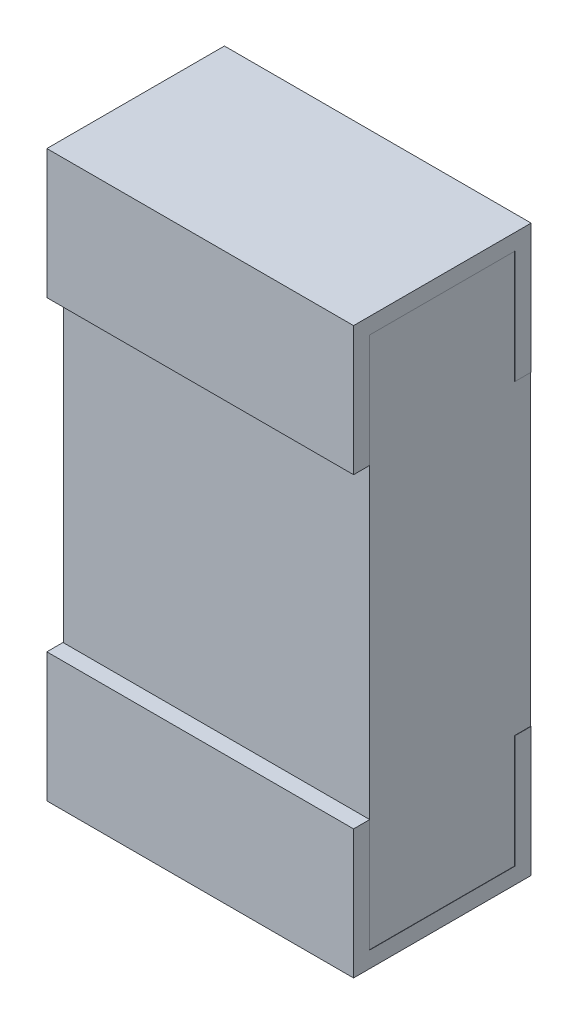
ISO-10303-21;
HEADER;
FILE_DESCRIPTION(('STEP AP214'),'2;1');
FILE_NAME('part.step','',(''),(''),'','','');
FILE_SCHEMA(('AUTOMOTIVE_DESIGN { 1 0 10303 214 1 1 1 1 }'));
ENDSEC;
DATA;
#1=APPLICATION_CONTEXT('core data for automotive mechanical design processes');
#2=APPLICATION_PROTOCOL_DEFINITION('international standard','automotive_design',2000,#1);
#3=PRODUCT_CONTEXT('',#1,'mechanical');
#4=PRODUCT('Part','Part','',(#3));
#5=PRODUCT_RELATED_PRODUCT_CATEGORY('part','',(#4));
#6=PRODUCT_DEFINITION_FORMATION('','',#4);
#7=PRODUCT_DEFINITION_CONTEXT('part definition',#1,'design');
#8=PRODUCT_DEFINITION('design','',#6,#7);
#9=PRODUCT_DEFINITION_SHAPE('','',#8);
#10=(LENGTH_UNIT() NAMED_UNIT(*) SI_UNIT(.MILLI.,.METRE.));
#11=(NAMED_UNIT(*) PLANE_ANGLE_UNIT() SI_UNIT($,.RADIAN.));
#12=(NAMED_UNIT(*) SI_UNIT($,.STERADIAN.) SOLID_ANGLE_UNIT());
#13=UNCERTAINTY_MEASURE_WITH_UNIT(LENGTH_MEASURE(1.E-05),#10,'distance_accuracy_value','');
#14=(GEOMETRIC_REPRESENTATION_CONTEXT(3) GLOBAL_UNCERTAINTY_ASSIGNED_CONTEXT((#13)) GLOBAL_UNIT_ASSIGNED_CONTEXT((#10,
#11,#12)) REPRESENTATION_CONTEXT('',''));
#15=CARTESIAN_POINT('',(0.,0.,0.));
#16=DIRECTION('',(0.,0.,1.));
#17=DIRECTION('',(1.,0.,0.));
#18=AXIS2_PLACEMENT_3D('',#15,#16,#17);
#19=CARTESIAN_POINT('',(-8.60769899649028,16.9660232839229,-0.486994255555745));
#20=DIRECTION('',(-1.,1.19248806384999E-08,0.));
#21=DIRECTION('',(0.,-8.74227339409095E-08,1.));
#22=AXIS2_PLACEMENT_3D('',#19,#20,#21);
#23=PLANE('',#22);
#24=DIRECTION('',(-1.19248806384999E-08,-1.,-8.74227339409095E-08));
#25=VECTOR('',#24,1.);
#26=CARTESIAN_POINT('',(-8.61246893890766,-399982.208976715,-0.521963277008353));
#27=LINE('',#26,#25);
#28=CARTESIAN_POINT('',(-8.60769899231657,17.3160232839487,-0.486994224957847));
#29=VERTEX_POINT('',#28);
#30=CARTESIAN_POINT('',(-8.60769899649028,16.9660232839228,-0.486994255555804));
#31=VERTEX_POINT('',#30);
#32=EDGE_CURVE('E276',#29,#31,#27,.T.);
#33=ORIENTED_EDGE('',*,*,#32,.F.);
#34=DIRECTION('',(0.,-8.74227339409095E-08,1.));
#35=VECTOR('',#34,1.);
#36=CARTESIAN_POINT('',(-8.60769899231657,17.3415156849243,-291599.706400024));
#37=LINE('',#36,#35);
#38=CARTESIAN_POINT('',(-8.60769899231657,17.3160232883198,-0.536994224945663));
#39=VERTEX_POINT('',#38);
#40=EDGE_CURVE('E28',#39,#29,#37,.T.);
#41=ORIENTED_EDGE('',*,*,#40,.F.);
#42=DIRECTION('',(1.19248806384999E-08,1.,8.74227339409095E-08));
#43=VECTOR('',#42,1.);
#44=CARTESIAN_POINT('',(-8.61246893890766,-399982.208976711,-0.571963276996353));
#45=LINE('',#44,#43);
#46=CARTESIAN_POINT('',(-8.60769899708652,16.9160232883061,-0.536994259914756));
#47=VERTEX_POINT('',#46);
#48=EDGE_CURVE('E335',#47,#39,#45,.T.);
#49=ORIENTED_EDGE('',*,*,#48,.F.);
#50=DIRECTION('',(0.,8.74227339409095E-08,-1.));
#51=VECTOR('',#50,1.);
#52=CARTESIAN_POINT('',(-8.60769899708652,16.9415156849103,-291599.706400059));
#53=LINE('',#52,#51);
#54=CARTESIAN_POINT('',(-8.60769899708652,16.9160232402236,0.0130057400611174));
#55=VERTEX_POINT('',#54);
#56=EDGE_CURVE('E1057',#55,#47,#53,.T.);
#57=ORIENTED_EDGE('',*,*,#56,.F.);
#58=DIRECTION('',(-1.19248806384999E-08,-1.,-8.74227339409095E-08));
#59=VECTOR('',#58,1.);
#60=CARTESIAN_POINT('',(-8.61246893890766,-399982.208976759,-0.0219632770203544));
#61=LINE('',#60,#59);
#62=CARTESIAN_POINT('',(-8.60769899231657,17.3160232402373,0.013005775030211));
#63=VERTEX_POINT('',#62);
#64=EDGE_CURVE('E1075',#63,#55,#61,.T.);
#65=ORIENTED_EDGE('',*,*,#64,.F.);
#66=CARTESIAN_POINT('',(-8.60769899231657,17.3160232446085,-0.036994224956362));
#67=VERTEX_POINT('',#66);
#68=EDGE_CURVE('E340',#67,#63,#37,.T.);
#69=ORIENTED_EDGE('',*,*,#68,.F.);
#70=DIRECTION('',(1.19248806384999E-08,1.,8.74227339409095E-08));
#71=VECTOR('',#70,1.);
#72=CARTESIAN_POINT('',(-8.61246893890766,-399982.208976755,-0.0719632770078043));
#73=LINE('',#72,#71);
#74=CARTESIAN_POINT('',(-8.60769899649028,16.9660232445825,-0.0369942555534424));
#75=VERTEX_POINT('',#74);
#76=EDGE_CURVE('E397',#75,#67,#73,.T.);
#77=ORIENTED_EDGE('',*,*,#76,.F.);
#78=DIRECTION('',(0.,-8.74227339409095E-08,1.));
#79=VECTOR('',#78,1.);
#80=CARTESIAN_POINT('',(-8.60769899649028,16.9915156848983,-291599.706400055));
#81=LINE('',#80,#79);
#82=EDGE_CURVE('E342',#31,#75,#81,.T.);
#83=ORIENTED_EDGE('',*,*,#82,.F.);
#84=EDGE_LOOP('',(#33,#41,#49,#57,#65,#69,#77,#83));
#85=FACE_BOUND('',#84,.T.);
#86=ADVANCED_FACE('F17',(#85),#23,.T.);
#87=CARTESIAN_POINT('',(-7.65769899649027,16.9660232725942,-0.486994255555746));
#88=DIRECTION('',(-1.,1.19248806384999E-08,0.));
#89=DIRECTION('',(0.,-8.74227339409095E-08,1.));
#90=AXIS2_PLACEMENT_3D('',#87,#88,#89);
#91=PLANE('',#90);
#92=DIRECTION('',(-1.19248806384999E-08,-1.,-8.74227339409095E-08));
#93=VECTOR('',#92,1.);
#94=CARTESIAN_POINT('',(-7.66246893890765,-399982.208976727,-0.521963277008354));
#95=LINE('',#94,#93);
#96=CARTESIAN_POINT('',(-7.65769899231658,17.3160232726201,-0.486994224957848));
#97=VERTEX_POINT('',#96);
#98=CARTESIAN_POINT('',(-7.65769899649027,16.9660232725941,-0.486994255555805));
#99=VERTEX_POINT('',#98);
#100=EDGE_CURVE('E252',#97,#99,#95,.T.);
#101=ORIENTED_EDGE('',*,*,#100,.T.);
#102=DIRECTION('',(0.,-8.74227339409095E-08,1.));
#103=VECTOR('',#102,1.);
#104=CARTESIAN_POINT('',(-7.65769899649027,16.9915156735697,-291599.706400055));
#105=LINE('',#104,#103);
#106=CARTESIAN_POINT('',(-7.65769899649027,16.9660232332539,-0.0369942555534433));
#107=VERTEX_POINT('',#106);
#108=EDGE_CURVE('E283',#99,#107,#105,.T.);
#109=ORIENTED_EDGE('',*,*,#108,.T.);
#110=DIRECTION('',(1.19248806384999E-08,1.,8.74227339409095E-08));
#111=VECTOR('',#110,1.);
#112=CARTESIAN_POINT('',(-7.65769899649027,16.966023233254,-0.0369942555551971));
#113=LINE('',#112,#111);
#114=CARTESIAN_POINT('',(-7.65769899231658,17.3160232332799,-0.0369942249563629));
#115=VERTEX_POINT('',#114);
#116=EDGE_CURVE('E369',#107,#115,#113,.T.);
#117=ORIENTED_EDGE('',*,*,#116,.T.);
#118=DIRECTION('',(0.,-8.74227339409095E-08,1.));
#119=VECTOR('',#118,1.);
#120=CARTESIAN_POINT('',(-7.65769899231658,17.3415156735958,-291599.706400024));
#121=LINE('',#120,#119);
#122=CARTESIAN_POINT('',(-7.65769899231658,17.3160232289087,0.0130057750302097));
#123=VERTEX_POINT('',#122);
#124=EDGE_CURVE('E436',#115,#123,#121,.T.);
#125=ORIENTED_EDGE('',*,*,#124,.T.);
#126=DIRECTION('',(-1.19248806384999E-08,-1.,-8.74227339409095E-08));
#127=VECTOR('',#126,1.);
#128=CARTESIAN_POINT('',(-7.66246893890765,-399982.20897677,-0.0219632770203553));
#129=LINE('',#128,#127);
#130=CARTESIAN_POINT('',(-7.65769899708652,16.916023228895,0.0130057400611161));
#131=VERTEX_POINT('',#130);
#132=EDGE_CURVE('E1060',#123,#131,#129,.T.);
#133=ORIENTED_EDGE('',*,*,#132,.T.);
#134=DIRECTION('',(0.,8.74227339409095E-08,-1.));
#135=VECTOR('',#134,1.);
#136=CARTESIAN_POINT('',(-7.65769899708652,16.9415156735818,-291599.706400059));
#137=LINE('',#136,#135);
#138=CARTESIAN_POINT('',(-7.65769899708652,16.9160232769775,-0.536994259914757));
#139=VERTEX_POINT('',#138);
#140=EDGE_CURVE('E1050',#131,#139,#137,.T.);
#141=ORIENTED_EDGE('',*,*,#140,.T.);
#142=DIRECTION('',(1.19248806384999E-08,1.,8.74227339409095E-08));
#143=VECTOR('',#142,1.);
#144=CARTESIAN_POINT('',(-7.66246893890765,-399982.208976722,-0.571963276996354));
#145=LINE('',#144,#143);
#146=CARTESIAN_POINT('',(-7.65769899231658,17.3160232769912,-0.536994224945664));
#147=VERTEX_POINT('',#146);
#148=EDGE_CURVE('E255',#139,#147,#145,.T.);
#149=ORIENTED_EDGE('',*,*,#148,.T.);
#150=EDGE_CURVE('E41',#147,#97,#121,.T.);
#151=ORIENTED_EDGE('',*,*,#150,.T.);
#152=EDGE_LOOP('',(#101,#109,#117,#125,#133,#141,#149,#151));
#153=FACE_BOUND('',#152,.T.);
#154=ADVANCED_FACE('F249',(#153),#91,.F.);
#155=CARTESIAN_POINT('',(-7.65769899231658,17.3415156735958,-291599.706400024));
#156=DIRECTION('',(-1.19248806384999E-08,-1.,-8.74227339409095E-08));
#157=DIRECTION('',(0.,8.74227339409095E-08,-1.));
#158=AXIS2_PLACEMENT_3D('',#155,#156,#157);
#159=PLANE('',#158);
#160=DIRECTION('',(-1.,1.19248806384999E-08,0.));
#161=VECTOR('',#160,1.);
#162=CARTESIAN_POINT('',(-7.65969899231658,17.3160232769278,-0.535994224947789));
#163=LINE('',#162,#161);
#164=CARTESIAN_POINT('',(-7.65869899231658,17.3160232769157,-0.535994224947789));
#165=VERTEX_POINT('',#164);
#166=CARTESIAN_POINT('',(-8.60669899231657,17.3160232882206,-0.535994224947863));
#167=VERTEX_POINT('',#166);
#168=EDGE_CURVE('E367',#165,#167,#163,.T.);
#169=ORIENTED_EDGE('',*,*,#168,.F.);
#170=DIRECTION('',(0.,8.74227339409095E-08,-1.));
#171=VECTOR('',#170,1.);
#172=CARTESIAN_POINT('',(-7.65869899231658,17.316023233292,-0.0369942249572402));
#173=LINE('',#172,#171);
#174=CARTESIAN_POINT('',(-7.65869899231658,17.316023272632,-0.486994224957789));
#175=VERTEX_POINT('',#174);
#176=EDGE_CURVE('E258',#165,#175,#173,.F.);
#177=ORIENTED_EDGE('',*,*,#176,.T.);
#178=DIRECTION('',(-1.,1.19248806384999E-08,0.));
#179=VECTOR('',#178,1.);
#180=CARTESIAN_POINT('',(-7.65769899231658,17.3160232726203,-0.486994224957789));
#181=LINE('',#180,#179);
#182=EDGE_CURVE('E261',#97,#175,#181,.T.);
#183=ORIENTED_EDGE('',*,*,#182,.F.);
#184=ORIENTED_EDGE('',*,*,#150,.F.);
#185=DIRECTION('',(-1.,1.19248806384999E-08,0.));
#186=VECTOR('',#185,1.);
#187=CARTESIAN_POINT('',(-7.65769899231658,17.3160232769914,-0.536994224945789));
#188=LINE('',#187,#186);
#189=EDGE_CURVE('E598',#147,#39,#188,.T.);
#190=ORIENTED_EDGE('',*,*,#189,.T.);
#191=ORIENTED_EDGE('',*,*,#40,.T.);
#192=CARTESIAN_POINT('',(-8.60669899231657,17.316023283965,-0.486994224957832));
#193=VERTEX_POINT('',#192);
#194=EDGE_CURVE('E602',#193,#29,#181,.T.);
#195=ORIENTED_EDGE('',*,*,#194,.F.);
#196=DIRECTION('',(0.,-8.74227339409095E-08,1.));
#197=VECTOR('',#196,1.);
#198=CARTESIAN_POINT('',(-8.60669899231657,17.3415156849124,-291599.706400024));
#199=LINE('',#198,#197);
#200=EDGE_CURVE('E11',#193,#167,#199,.F.);
#201=ORIENTED_EDGE('',*,*,#200,.T.);
#202=EDGE_LOOP('',(#169,#177,#183,#184,#190,#191,#195,#201));
#203=FACE_BOUND('',#202,.T.);
#204=ADVANCED_FACE('F263',(#203),#159,.F.);
#205=CARTESIAN_POINT('',(-7.66246893890765,-399982.208976722,-0.571963276996354));
#206=DIRECTION('',(0.,-8.74227339409095E-08,1.));
#207=DIRECTION('',(-1.19248806384999E-08,-1.,-8.74227339409095E-08));
#208=AXIS2_PLACEMENT_3D('',#205,#206,#207);
#209=PLANE('',#208);
#210=ORIENTED_EDGE('',*,*,#48,.T.);
#211=ORIENTED_EDGE('',*,*,#189,.F.);
#212=ORIENTED_EDGE('',*,*,#148,.F.);
#213=DIRECTION('',(-1.,1.19248806384999E-08,0.));
#214=VECTOR('',#213,1.);
#215=CARTESIAN_POINT('',(-7.65769899708652,16.9160232769774,-0.536994259914882));
#216=LINE('',#215,#214);
#217=EDGE_CURVE('E1047',#139,#47,#216,.T.);
#218=ORIENTED_EDGE('',*,*,#217,.T.);
#219=EDGE_LOOP('',(#210,#211,#212,#218));
#220=FACE_BOUND('',#219,.T.);
#221=ADVANCED_FACE('F703',(#220),#209,.F.);
#222=CARTESIAN_POINT('',(-7.65769899708652,16.9415156735818,-291599.706400059));
#223=DIRECTION('',(1.19248806384999E-08,1.,8.74227339409095E-08));
#224=DIRECTION('',(0.,-8.74227339409095E-08,1.));
#225=AXIS2_PLACEMENT_3D('',#222,#223,#224);
#226=PLANE('',#225);
#227=ORIENTED_EDGE('',*,*,#56,.T.);
#228=ORIENTED_EDGE('',*,*,#217,.F.);
#229=ORIENTED_EDGE('',*,*,#140,.F.);
#230=DIRECTION('',(-1.,1.19248806384999E-08,0.));
#231=VECTOR('',#230,1.);
#232=CARTESIAN_POINT('',(-7.65769899708652,16.9160232288949,0.0130057400611161));
#233=LINE('',#232,#231);
#234=EDGE_CURVE('E1081',#131,#55,#233,.T.);
#235=ORIENTED_EDGE('',*,*,#234,.T.);
#236=EDGE_LOOP('',(#227,#228,#229,#235));
#237=FACE_BOUND('',#236,.T.);
#238=ADVANCED_FACE('F704',(#237),#226,.F.);
#239=CARTESIAN_POINT('',(-7.66246893890765,-399982.20897677,-0.0219632770203553));
#240=DIRECTION('',(0.,8.74227339409095E-08,-1.));
#241=DIRECTION('',(1.19248806384999E-08,1.,8.74227339409095E-08));
#242=AXIS2_PLACEMENT_3D('',#239,#240,#241);
#243=PLANE('',#242);
#244=ORIENTED_EDGE('',*,*,#64,.T.);
#245=ORIENTED_EDGE('',*,*,#234,.F.);
#246=ORIENTED_EDGE('',*,*,#132,.F.);
#247=DIRECTION('',(-1.,1.19248806384999E-08,0.));
#248=VECTOR('',#247,1.);
#249=CARTESIAN_POINT('',(-7.65769899231658,17.3160232289089,0.0130057750302097));
#250=LINE('',#249,#248);
#251=EDGE_CURVE('E458',#123,#63,#250,.T.);
#252=ORIENTED_EDGE('',*,*,#251,.T.);
#253=EDGE_LOOP('',(#244,#245,#246,#252));
#254=FACE_BOUND('',#253,.T.);
#255=ADVANCED_FACE('F707',(#254),#243,.F.);
#256=ORIENTED_EDGE('',*,*,#68,.T.);
#257=ORIENTED_EDGE('',*,*,#251,.F.);
#258=ORIENTED_EDGE('',*,*,#124,.F.);
#259=DIRECTION('',(-1.,1.19248806384999E-08,0.));
#260=VECTOR('',#259,1.);
#261=CARTESIAN_POINT('',(-7.65769899231658,17.31602323328,-0.0369942249572388));
#262=LINE('',#261,#260);
#263=CARTESIAN_POINT('',(-7.65869899231658,17.3160232332918,-0.0369942249565827));
#264=VERTEX_POINT('',#263);
#265=EDGE_CURVE('E373',#115,#264,#262,.T.);
#266=ORIENTED_EDGE('',*,*,#265,.T.);
#267=DIRECTION('',(-1.,1.19248806384999E-08,0.));
#268=VECTOR('',#267,1.);
#269=CARTESIAN_POINT('',(-7.65769899231658,17.31602323328,-0.0369942249572402));
#270=LINE('',#269,#268);
#271=CARTESIAN_POINT('',(-8.60669899231657,17.3160232445965,-0.0369942249572388));
#272=VERTEX_POINT('',#271);
#273=EDGE_CURVE('E376',#264,#272,#270,.T.);
#274=ORIENTED_EDGE('',*,*,#273,.T.);
#275=EDGE_CURVE('E347',#272,#67,#262,.T.);
#276=ORIENTED_EDGE('',*,*,#275,.T.);
#277=EDGE_LOOP('',(#256,#257,#258,#266,#274,#276));
#278=FACE_BOUND('',#277,.T.);
#279=ADVANCED_FACE('F432',(#278),#159,.F.);
#280=CARTESIAN_POINT('',(-7.66246893890765,-399982.208976766,-0.0719632770078051));
#281=DIRECTION('',(0.,8.74227339409095E-08,-1.));
#282=DIRECTION('',(1.19248806384999E-08,1.,8.74227339409095E-08));
#283=AXIS2_PLACEMENT_3D('',#280,#281,#282);
#284=PLANE('',#283);
#285=DIRECTION('',(-1.19248806384999E-08,-1.,-8.74227339409095E-08));
#286=VECTOR('',#285,1.);
#287=CARTESIAN_POINT('',(-7.65869899649027,16.9660232332659,-0.0369942555551971));
#288=LINE('',#287,#286);
#289=CARTESIAN_POINT('',(-7.65869899649027,16.9660232332659,-0.0369942555534433));
#290=VERTEX_POINT('',#289);
#291=EDGE_CURVE('E381',#264,#290,#288,.T.);
#292=ORIENTED_EDGE('',*,*,#291,.F.);
#293=ORIENTED_EDGE('',*,*,#265,.F.);
#294=ORIENTED_EDGE('',*,*,#116,.F.);
#295=DIRECTION('',(-1.,1.19248806384999E-08,0.));
#296=VECTOR('',#295,1.);
#297=CARTESIAN_POINT('',(-7.65769899649027,16.9660232332537,-0.0369942555551971));
#298=LINE('',#297,#296);
#299=EDGE_CURVE('E268',#107,#290,#298,.T.);
#300=ORIENTED_EDGE('',*,*,#299,.T.);
#301=EDGE_LOOP('',(#292,#293,#294,#300));
#302=FACE_BOUND('',#301,.T.);
#303=ADVANCED_FACE('F438',(#302),#284,.T.);
#304=CARTESIAN_POINT('',(-7.65769899649027,16.9915156735697,-291599.706400055));
#305=DIRECTION('',(-1.19248806384999E-08,-1.,-8.74227339409095E-08));
#306=DIRECTION('',(0.,8.74227339409095E-08,-1.));
#307=AXIS2_PLACEMENT_3D('',#304,#305,#306);
#308=PLANE('',#307);
#309=DIRECTION('',(0.,8.74227339409095E-08,-1.));
#310=VECTOR('',#309,1.);
#311=CARTESIAN_POINT('',(-7.65869899649027,16.9915156735816,-291599.706400055));
#312=LINE('',#311,#310);
#313=CARTESIAN_POINT('',(-7.65869899649027,16.9660232726062,-0.486994255555746));
#314=VERTEX_POINT('',#313);
#315=EDGE_CURVE('E385',#290,#314,#312,.T.);
#316=ORIENTED_EDGE('',*,*,#315,.F.);
#317=ORIENTED_EDGE('',*,*,#299,.F.);
#318=ORIENTED_EDGE('',*,*,#108,.F.);
#319=DIRECTION('',(-1.,1.19248806384999E-08,0.));
#320=VECTOR('',#319,1.);
#321=CARTESIAN_POINT('',(-7.65769899649027,16.9660232725942,-0.486994255555746));
#322=LINE('',#321,#320);
#323=EDGE_CURVE('E271',#99,#314,#322,.T.);
#324=ORIENTED_EDGE('',*,*,#323,.T.);
#325=EDGE_LOOP('',(#316,#317,#318,#324));
#326=FACE_BOUND('',#325,.T.);
#327=ADVANCED_FACE('F443',(#326),#308,.F.);
#328=CARTESIAN_POINT('',(-7.66246893890765,-399982.208976727,-0.521963277008354));
#329=DIRECTION('',(0.,8.74227339409095E-08,-1.));
#330=DIRECTION('',(1.19248806384999E-08,1.,8.74227339409095E-08));
#331=AXIS2_PLACEMENT_3D('',#328,#329,#330);
#332=PLANE('',#331);
#333=DIRECTION('',(1.19248806384999E-08,1.,8.74227339409095E-08));
#334=VECTOR('',#333,1.);
#335=CARTESIAN_POINT('',(-7.66346893890765,-399982.208976727,-0.521963277008354));
#336=LINE('',#335,#334);
#337=EDGE_CURVE('E445',#314,#175,#336,.T.);
#338=ORIENTED_EDGE('',*,*,#337,.F.);
#339=ORIENTED_EDGE('',*,*,#323,.F.);
#340=ORIENTED_EDGE('',*,*,#100,.F.);
#341=ORIENTED_EDGE('',*,*,#182,.T.);
#342=EDGE_LOOP('',(#338,#339,#340,#341));
#343=FACE_BOUND('',#342,.T.);
#344=ADVANCED_FACE('F270',(#343),#332,.F.);
#345=CARTESIAN_POINT('',(-8.60669899649028,16.9660232839109,-0.486994255555745));
#346=VERTEX_POINT('',#345);
#347=EDGE_CURVE('E215',#346,#31,#322,.T.);
#348=ORIENTED_EDGE('',*,*,#347,.F.);
#349=DIRECTION('',(1.19248806384999E-08,1.,8.74227339409095E-08));
#350=VECTOR('',#349,1.);
#351=CARTESIAN_POINT('',(-8.61146893890766,-399982.208976715,-0.521963277008353));
#352=LINE('',#351,#350);
#353=EDGE_CURVE('E467',#346,#193,#352,.T.);
#354=ORIENTED_EDGE('',*,*,#353,.T.);
#355=ORIENTED_EDGE('',*,*,#194,.T.);
#356=ORIENTED_EDGE('',*,*,#32,.T.);
#357=EDGE_LOOP('',(#348,#354,#355,#356));
#358=FACE_BOUND('',#357,.T.);
#359=ADVANCED_FACE('F690',(#358),#332,.F.);
#360=ORIENTED_EDGE('',*,*,#275,.F.);
#361=DIRECTION('',(-1.19248806384999E-08,-1.,-8.74227339409095E-08));
#362=VECTOR('',#361,1.);
#363=CARTESIAN_POINT('',(-8.61146893890766,-399982.208976755,-0.0719632770078043));
#364=LINE('',#363,#362);
#365=CARTESIAN_POINT('',(-8.60669899649028,16.9660232445706,-0.0369942555543189));
#366=VERTEX_POINT('',#365);
#367=EDGE_CURVE('E477',#272,#366,#364,.T.);
#368=ORIENTED_EDGE('',*,*,#367,.T.);
#369=EDGE_CURVE('E387',#366,#75,#298,.T.);
#370=ORIENTED_EDGE('',*,*,#369,.T.);
#371=ORIENTED_EDGE('',*,*,#76,.T.);
#372=EDGE_LOOP('',(#360,#368,#370,#371));
#373=FACE_BOUND('',#372,.T.);
#374=ADVANCED_FACE('F679',(#373),#284,.T.);
#375=ORIENTED_EDGE('',*,*,#369,.F.);
#376=DIRECTION('',(0.,8.74227339409095E-08,-1.));
#377=VECTOR('',#376,1.);
#378=CARTESIAN_POINT('',(-8.60669899649028,16.9915156848864,-291599.706400055));
#379=LINE('',#378,#377);
#380=EDGE_CURVE('E470',#366,#346,#379,.T.);
#381=ORIENTED_EDGE('',*,*,#380,.T.);
#382=ORIENTED_EDGE('',*,*,#347,.T.);
#383=ORIENTED_EDGE('',*,*,#82,.T.);
#384=EDGE_LOOP('',(#375,#381,#382,#383));
#385=FACE_BOUND('',#384,.T.);
#386=ADVANCED_FACE('F689',(#385),#308,.F.);
#387=CARTESIAN_POINT('',(-8.60769897681422,18.6160232446226,-0.0369941113076847));
#388=DIRECTION('',(-1.,1.19248806384999E-08,0.));
#389=DIRECTION('',(0.,-8.74227339409095E-08,1.));
#390=AXIS2_PLACEMENT_3D('',#387,#388,#389);
#391=PLANE('',#390);
#392=CARTESIAN_POINT('',(-8.60769898098794,18.2660232445968,-0.036994141906518));
#393=VERTEX_POINT('',#392);
#394=CARTESIAN_POINT('',(-8.60769897681422,18.6160232446228,-0.0369941113085612));
#395=VERTEX_POINT('',#394);
#396=EDGE_CURVE('E391',#393,#395,#73,.T.);
#397=ORIENTED_EDGE('',*,*,#396,.F.);
#398=DIRECTION('',(0.,8.74227339409095E-08,-1.));
#399=VECTOR('',#398,1.);
#400=CARTESIAN_POINT('',(-8.60769898098794,18.2915156849123,-291599.706399941));
#401=LINE('',#400,#399);
#402=CARTESIAN_POINT('',(-8.60769898098794,18.2660232402256,0.0130058580818083));
#403=VERTEX_POINT('',#402);
#404=EDGE_CURVE('E305',#403,#393,#401,.T.);
#405=ORIENTED_EDGE('',*,*,#404,.F.);
#406=CARTESIAN_POINT('',(-8.60769897621798,18.6660232402394,0.0130058930509018));
#407=VERTEX_POINT('',#406);
#408=EDGE_CURVE('E311',#407,#403,#61,.T.);
#409=ORIENTED_EDGE('',*,*,#408,.F.);
#410=DIRECTION('',(0.,-8.74227339409095E-08,1.));
#411=VECTOR('',#410,1.);
#412=CARTESIAN_POINT('',(-8.60769897621798,18.6915156849264,-291599.706399906));
#413=LINE('',#412,#411);
#414=CARTESIAN_POINT('',(-8.60769897621798,18.6660232883219,-0.536994106924972));
#415=VERTEX_POINT('',#414);
#416=EDGE_CURVE('E535',#415,#407,#413,.T.);
#417=ORIENTED_EDGE('',*,*,#416,.F.);
#418=CARTESIAN_POINT('',(-8.60769898098794,18.2660232883082,-0.536994141894065));
#419=VERTEX_POINT('',#418);
#420=EDGE_CURVE('E296',#419,#415,#45,.T.);
#421=ORIENTED_EDGE('',*,*,#420,.F.);
#422=CARTESIAN_POINT('',(-8.60769898098794,18.266023283937,-0.48699414190625));
#423=VERTEX_POINT('',#422);
#424=EDGE_CURVE('E316',#423,#419,#401,.T.);
#425=ORIENTED_EDGE('',*,*,#424,.F.);
#426=CARTESIAN_POINT('',(-8.60769897681422,18.616023283963,-0.486994111308293));
#427=VERTEX_POINT('',#426);
#428=EDGE_CURVE('E318',#427,#423,#27,.T.);
#429=ORIENTED_EDGE('',*,*,#428,.F.);
#430=DIRECTION('',(0.,8.74227339409095E-08,-1.));
#431=VECTOR('',#430,1.);
#432=CARTESIAN_POINT('',(-8.60769897681422,18.6415156849384,-291599.706399911));
#433=LINE('',#432,#431);
#434=EDGE_CURVE('E326',#395,#427,#433,.T.);
#435=ORIENTED_EDGE('',*,*,#434,.F.);
#436=EDGE_LOOP('',(#397,#405,#409,#417,#421,#425,#429,#435));
#437=FACE_BOUND('',#436,.T.);
#438=ADVANCED_FACE('F714',(#437),#391,.T.);
#439=CARTESIAN_POINT('',(-7.65769897681423,18.616023233294,-0.036994111307686));
#440=DIRECTION('',(-1.,1.19248806384999E-08,0.));
#441=DIRECTION('',(0.,-8.74227339409095E-08,1.));
#442=AXIS2_PLACEMENT_3D('',#439,#440,#441);
#443=PLANE('',#442);
#444=DIRECTION('',(1.19248806384999E-08,1.,8.74227339409095E-08));
#445=VECTOR('',#444,1.);
#446=CARTESIAN_POINT('',(-7.65769897681423,18.616023233294,-0.036994111307686));
#447=LINE('',#446,#445);
#448=CARTESIAN_POINT('',(-7.65769898098795,18.2660232332682,-0.0369941419065189));
#449=VERTEX_POINT('',#448);
#450=CARTESIAN_POINT('',(-7.65769897681423,18.6160232332941,-0.036994111308562));
#451=VERTEX_POINT('',#450);
#452=EDGE_CURVE('E398',#449,#451,#447,.T.);
#453=ORIENTED_EDGE('',*,*,#452,.T.);
#454=DIRECTION('',(0.,8.74227339409095E-08,-1.));
#455=VECTOR('',#454,1.);
#456=CARTESIAN_POINT('',(-7.65769897681423,18.6415156736097,-291599.706399911));
#457=LINE('',#456,#455);
#458=CARTESIAN_POINT('',(-7.65769897681423,18.6160232726344,-0.486994111308294));
#459=VERTEX_POINT('',#458);
#460=EDGE_CURVE('E518',#451,#459,#457,.T.);
#461=ORIENTED_EDGE('',*,*,#460,.T.);
#462=CARTESIAN_POINT('',(-7.65769898098795,18.2660232726084,-0.486994141906251));
#463=VERTEX_POINT('',#462);
#464=EDGE_CURVE('E288',#459,#463,#95,.T.);
#465=ORIENTED_EDGE('',*,*,#464,.T.);
#466=DIRECTION('',(0.,8.74227339409095E-08,-1.));
#467=VECTOR('',#466,1.);
#468=CARTESIAN_POINT('',(-7.65769898098795,18.2915156735838,-291599.706399941));
#469=LINE('',#468,#467);
#470=CARTESIAN_POINT('',(-7.65769898098795,18.2660232769795,-0.536994141894066));
#471=VERTEX_POINT('',#470);
#472=EDGE_CURVE('E290',#463,#471,#469,.T.);
#473=ORIENTED_EDGE('',*,*,#472,.T.);
#474=CARTESIAN_POINT('',(-7.65769897621799,18.6660232769933,-0.536994106924973));
#475=VERTEX_POINT('',#474);
#476=EDGE_CURVE('E298',#471,#475,#145,.T.);
#477=ORIENTED_EDGE('',*,*,#476,.T.);
#478=DIRECTION('',(0.,-8.74227339409095E-08,1.));
#479=VECTOR('',#478,1.);
#480=CARTESIAN_POINT('',(-7.65769897621799,18.6915156735977,-291599.706399906));
#481=LINE('',#480,#479);
#482=CARTESIAN_POINT('',(-7.65769897621799,18.6660232289108,0.0130058930509005));
#483=VERTEX_POINT('',#482);
#484=EDGE_CURVE('E534',#475,#483,#481,.T.);
#485=ORIENTED_EDGE('',*,*,#484,.T.);
#486=CARTESIAN_POINT('',(-7.65769898098795,18.2660232288971,0.013005858081807));
#487=VERTEX_POINT('',#486);
#488=EDGE_CURVE('E310',#483,#487,#129,.T.);
#489=ORIENTED_EDGE('',*,*,#488,.T.);
#490=EDGE_CURVE('E303',#487,#449,#469,.T.);
#491=ORIENTED_EDGE('',*,*,#490,.T.);
#492=EDGE_LOOP('',(#453,#461,#465,#473,#477,#485,#489,#491));
#493=FACE_BOUND('',#492,.T.);
#494=ADVANCED_FACE('F652',(#493),#443,.F.);
#495=CARTESIAN_POINT('',(-7.65769898098795,18.2915156735838,-291599.706399941));
#496=DIRECTION('',(1.19248806384999E-08,1.,8.74227339409095E-08));
#497=DIRECTION('',(0.,-8.74227339409095E-08,1.));
#498=AXIS2_PLACEMENT_3D('',#495,#496,#497);
#499=PLANE('',#498);
#500=ORIENTED_EDGE('',*,*,#404,.T.);
#501=DIRECTION('',(-1.,1.19248806384999E-08,0.));
#502=VECTOR('',#501,1.);
#503=CARTESIAN_POINT('',(-7.65769898098795,18.2660232332685,-0.0369941419056429));
#504=LINE('',#503,#502);
#505=CARTESIAN_POINT('',(-8.60669898098794,18.266023244585,-0.0369941419056416));
#506=VERTEX_POINT('',#505);
#507=EDGE_CURVE('E396',#506,#393,#504,.T.);
#508=ORIENTED_EDGE('',*,*,#507,.F.);
#509=DIRECTION('',(-1.,1.19248806384999E-08,0.));
#510=VECTOR('',#509,1.);
#511=CARTESIAN_POINT('',(-7.65769898098795,18.266023233268,-0.0369941419056429));
#512=LINE('',#511,#510);
#513=CARTESIAN_POINT('',(-7.65869898098795,18.2660232332802,-0.0369941419056429));
#514=VERTEX_POINT('',#513);
#515=EDGE_CURVE('E403',#514,#506,#512,.T.);
#516=ORIENTED_EDGE('',*,*,#515,.F.);
#517=EDGE_CURVE('E402',#449,#514,#504,.T.);
#518=ORIENTED_EDGE('',*,*,#517,.F.);
#519=ORIENTED_EDGE('',*,*,#490,.F.);
#520=DIRECTION('',(-1.,1.19248806384999E-08,0.));
#521=VECTOR('',#520,1.);
#522=CARTESIAN_POINT('',(-7.65769898098795,18.2660232288968,0.013005858081807));
#523=LINE('',#522,#521);
#524=EDGE_CURVE('E538',#487,#403,#523,.T.);
#525=ORIENTED_EDGE('',*,*,#524,.T.);
#526=EDGE_LOOP('',(#500,#508,#516,#518,#519,#525));
#527=FACE_BOUND('',#526,.T.);
#528=ADVANCED_FACE('F666',(#527),#499,.F.);
#529=ORIENTED_EDGE('',*,*,#408,.T.);
#530=ORIENTED_EDGE('',*,*,#524,.F.);
#531=ORIENTED_EDGE('',*,*,#488,.F.);
#532=DIRECTION('',(-1.,1.19248806384999E-08,0.));
#533=VECTOR('',#532,1.);
#534=CARTESIAN_POINT('',(-7.65769897621799,18.6660232289109,0.0130058930509005));
#535=LINE('',#534,#533);
#536=EDGE_CURVE('E530',#483,#407,#535,.T.);
#537=ORIENTED_EDGE('',*,*,#536,.T.);
#538=EDGE_LOOP('',(#529,#530,#531,#537));
#539=FACE_BOUND('',#538,.T.);
#540=ADVANCED_FACE('F664',(#539),#243,.F.);
#541=CARTESIAN_POINT('',(-7.65769897621799,18.6915156735977,-291599.706399906));
#542=DIRECTION('',(-1.19248806384999E-08,-1.,-8.74227339409095E-08));
#543=DIRECTION('',(0.,8.74227339409095E-08,-1.));
#544=AXIS2_PLACEMENT_3D('',#541,#542,#543);
#545=PLANE('',#544);
#546=ORIENTED_EDGE('',*,*,#416,.T.);
#547=ORIENTED_EDGE('',*,*,#536,.F.);
#548=ORIENTED_EDGE('',*,*,#484,.F.);
#549=DIRECTION('',(-1.,1.19248806384999E-08,0.));
#550=VECTOR('',#549,1.);
#551=CARTESIAN_POINT('',(-7.65769897621799,18.6660232769934,-0.536994106925098));
#552=LINE('',#551,#550);
#553=EDGE_CURVE('E524',#475,#415,#552,.T.);
#554=ORIENTED_EDGE('',*,*,#553,.T.);
#555=EDGE_LOOP('',(#546,#547,#548,#554));
#556=FACE_BOUND('',#555,.T.);
#557=ADVANCED_FACE('F662',(#556),#545,.F.);
#558=ORIENTED_EDGE('',*,*,#420,.T.);
#559=ORIENTED_EDGE('',*,*,#553,.F.);
#560=ORIENTED_EDGE('',*,*,#476,.F.);
#561=DIRECTION('',(-1.,1.19248806384999E-08,0.));
#562=VECTOR('',#561,1.);
#563=CARTESIAN_POINT('',(-7.65769898098795,18.2660232769794,-0.536994141894192));
#564=LINE('',#563,#562);
#565=EDGE_CURVE('E297',#471,#419,#564,.T.);
#566=ORIENTED_EDGE('',*,*,#565,.T.);
#567=EDGE_LOOP('',(#558,#559,#560,#566));
#568=FACE_BOUND('',#567,.T.);
#569=ADVANCED_FACE('F657',(#568),#209,.F.);
#570=DIRECTION('',(0.,-8.74227339409095E-08,1.));
#571=VECTOR('',#570,1.);
#572=CARTESIAN_POINT('',(-7.65869898098795,18.2660232332799,-0.0369941419056429));
#573=LINE('',#572,#571);
#574=CARTESIAN_POINT('',(-7.65869898098795,18.2660232726203,-0.486994141906192));
#575=VERTEX_POINT('',#574);
#576=CARTESIAN_POINT('',(-7.65869898098795,18.2660232769041,-0.535994141896192));
#577=VERTEX_POINT('',#576);
#578=EDGE_CURVE('E350',#575,#577,#573,.F.);
#579=ORIENTED_EDGE('',*,*,#578,.T.);
#580=DIRECTION('',(-1.,1.19248806384999E-08,0.));
#581=VECTOR('',#580,1.);
#582=CARTESIAN_POINT('',(-7.65969898098795,18.2660232769158,-0.535994141896192));
#583=LINE('',#582,#581);
#584=CARTESIAN_POINT('',(-8.60669898098794,18.2660232882087,-0.535994141896266));
#585=VERTEX_POINT('',#584);
#586=EDGE_CURVE('E361',#577,#585,#583,.T.);
#587=ORIENTED_EDGE('',*,*,#586,.T.);
#588=DIRECTION('',(0.,8.74227339409095E-08,-1.));
#589=VECTOR('',#588,1.);
#590=CARTESIAN_POINT('',(-8.60669898098794,18.2915156849004,-291599.706399941));
#591=LINE('',#590,#589);
#592=CARTESIAN_POINT('',(-8.60669898098794,18.2660232839536,-0.486994141906235));
#593=VERTEX_POINT('',#592);
#594=EDGE_CURVE('E353',#585,#593,#591,.F.);
#595=ORIENTED_EDGE('',*,*,#594,.T.);
#596=DIRECTION('',(-1.,1.19248806384999E-08,0.));
#597=VECTOR('',#596,1.);
#598=CARTESIAN_POINT('',(-7.65769898098795,18.2660232726083,-0.486994141906192));
#599=LINE('',#598,#597);
#600=EDGE_CURVE('E325',#593,#423,#599,.T.);
#601=ORIENTED_EDGE('',*,*,#600,.T.);
#602=ORIENTED_EDGE('',*,*,#424,.T.);
#603=ORIENTED_EDGE('',*,*,#565,.F.);
#604=ORIENTED_EDGE('',*,*,#472,.F.);
#605=EDGE_CURVE('E513',#463,#575,#599,.T.);
#606=ORIENTED_EDGE('',*,*,#605,.T.);
#607=EDGE_LOOP('',(#579,#587,#595,#601,#602,#603,#604,#606));
#608=FACE_BOUND('',#607,.T.);
#609=ADVANCED_FACE('F655',(#608),#499,.F.);
#610=DIRECTION('',(1.19248806384999E-08,1.,8.74227339409095E-08));
#611=VECTOR('',#610,1.);
#612=CARTESIAN_POINT('',(-7.65869899649027,16.9660232726062,-0.486994255555746));
#613=LINE('',#612,#611);
#614=CARTESIAN_POINT('',(-7.65869897681423,18.6160232726461,-0.486994111308235));
#615=VERTEX_POINT('',#614);
#616=EDGE_CURVE('E449',#575,#615,#613,.T.);
#617=ORIENTED_EDGE('',*,*,#616,.F.);
#618=ORIENTED_EDGE('',*,*,#605,.F.);
#619=ORIENTED_EDGE('',*,*,#464,.F.);
#620=DIRECTION('',(-1.,1.19248806384999E-08,0.));
#621=VECTOR('',#620,1.);
#622=CARTESIAN_POINT('',(-7.65769897681423,18.6160232726343,-0.486994111308235));
#623=LINE('',#622,#621);
#624=EDGE_CURVE('E410',#459,#615,#623,.T.);
#625=ORIENTED_EDGE('',*,*,#624,.T.);
#626=EDGE_LOOP('',(#617,#618,#619,#625));
#627=FACE_BOUND('',#626,.T.);
#628=ADVANCED_FACE('F557',(#627),#332,.F.);
#629=CARTESIAN_POINT('',(-7.65769897681423,18.6415156736097,-291599.706399911));
#630=DIRECTION('',(1.19248806384999E-08,1.,8.74227339409095E-08));
#631=DIRECTION('',(0.,-8.74227339409095E-08,1.));
#632=AXIS2_PLACEMENT_3D('',#629,#630,#631);
#633=PLANE('',#632);
#634=DIRECTION('',(0.,-8.74227339409095E-08,1.));
#635=VECTOR('',#634,1.);
#636=CARTESIAN_POINT('',(-7.65869897681423,18.6415156736217,-291599.706399911));
#637=LINE('',#636,#635);
#638=CARTESIAN_POINT('',(-7.65869897681423,18.616023233306,-0.0369941113076855));
#639=VERTEX_POINT('',#638);
#640=EDGE_CURVE('E498',#615,#639,#637,.T.);
#641=ORIENTED_EDGE('',*,*,#640,.F.);
#642=ORIENTED_EDGE('',*,*,#624,.F.);
#643=ORIENTED_EDGE('',*,*,#460,.F.);
#644=DIRECTION('',(-1.,1.19248806384999E-08,0.));
#645=VECTOR('',#644,1.);
#646=CARTESIAN_POINT('',(-7.65769897681423,18.616023233294,-0.0369941113076847));
#647=LINE('',#646,#645);
#648=EDGE_CURVE('E324',#451,#639,#647,.T.);
#649=ORIENTED_EDGE('',*,*,#648,.T.);
#650=EDGE_LOOP('',(#641,#642,#643,#649));
#651=FACE_BOUND('',#650,.T.);
#652=ADVANCED_FACE('F562',(#651),#633,.F.);
#653=EDGE_CURVE('E386',#639,#514,#288,.T.);
#654=ORIENTED_EDGE('',*,*,#653,.F.);
#655=ORIENTED_EDGE('',*,*,#648,.F.);
#656=ORIENTED_EDGE('',*,*,#452,.F.);
#657=ORIENTED_EDGE('',*,*,#517,.T.);
#658=EDGE_LOOP('',(#654,#655,#656,#657));
#659=FACE_BOUND('',#658,.T.);
#660=ADVANCED_FACE('F671',(#659),#284,.T.);
#661=ORIENTED_EDGE('',*,*,#600,.F.);
#662=DIRECTION('',(1.19248806384999E-08,1.,8.74227339409095E-08));
#663=VECTOR('',#662,1.);
#664=CARTESIAN_POINT('',(-8.60669899649028,16.9660232839109,-0.486994255555745));
#665=LINE('',#664,#663);
#666=CARTESIAN_POINT('',(-8.60669897681422,18.616023283951,-0.486994111308234));
#667=VERTEX_POINT('',#666);
#668=EDGE_CURVE('E471',#593,#667,#665,.T.);
#669=ORIENTED_EDGE('',*,*,#668,.T.);
#670=EDGE_CURVE('E395',#667,#427,#623,.T.);
#671=ORIENTED_EDGE('',*,*,#670,.T.);
#672=ORIENTED_EDGE('',*,*,#428,.T.);
#673=EDGE_LOOP('',(#661,#669,#671,#672));
#674=FACE_BOUND('',#673,.T.);
#675=ADVANCED_FACE('F678',(#674),#332,.F.);
#676=ORIENTED_EDGE('',*,*,#670,.F.);
#677=DIRECTION('',(0.,-8.74227339409095E-08,1.));
#678=VECTOR('',#677,1.);
#679=CARTESIAN_POINT('',(-8.60669897681422,18.6415156849265,-291599.706399911));
#680=LINE('',#679,#678);
#681=CARTESIAN_POINT('',(-8.60669897681422,18.6160232446108,-0.0369941113076847));
#682=VERTEX_POINT('',#681);
#683=EDGE_CURVE('E479',#667,#682,#680,.T.);
#684=ORIENTED_EDGE('',*,*,#683,.T.);
#685=EDGE_CURVE('E360',#682,#395,#647,.T.);
#686=ORIENTED_EDGE('',*,*,#685,.T.);
#687=ORIENTED_EDGE('',*,*,#434,.T.);
#688=EDGE_LOOP('',(#676,#684,#686,#687));
#689=FACE_BOUND('',#688,.T.);
#690=ADVANCED_FACE('F685',(#689),#633,.F.);
#691=ORIENTED_EDGE('',*,*,#685,.F.);
#692=EDGE_CURVE('E21',#682,#506,#364,.T.);
#693=ORIENTED_EDGE('',*,*,#692,.T.);
#694=ORIENTED_EDGE('',*,*,#507,.T.);
#695=ORIENTED_EDGE('',*,*,#396,.T.);
#696=EDGE_LOOP('',(#691,#693,#694,#695));
#697=FACE_BOUND('',#696,.T.);
#698=ADVANCED_FACE('F19',(#697),#284,.T.);
#699=CARTESIAN_POINT('',(-7.66446893890765,-399982.208976722,-0.570963276998354));
#700=DIRECTION('',(0.,-8.74227339409095E-08,1.));
#701=DIRECTION('',(-1.19248806384999E-08,-1.,-8.74227339409095E-08));
#702=AXIS2_PLACEMENT_3D('',#699,#700,#701);
#703=PLANE('',#702);
#704=ORIENTED_EDGE('',*,*,#168,.T.);
#705=DIRECTION('',(-1.19248806384999E-08,-1.,-8.74227339409095E-08));
#706=VECTOR('',#705,1.);
#707=CARTESIAN_POINT('',(-8.60669899649028,16.9660232881946,-0.535994255545744));
#708=LINE('',#707,#706);
#709=EDGE_CURVE('E364',#167,#585,#708,.F.);
#710=ORIENTED_EDGE('',*,*,#709,.T.);
#711=ORIENTED_EDGE('',*,*,#586,.F.);
#712=DIRECTION('',(1.19248806384999E-08,1.,8.74227339409095E-08));
#713=VECTOR('',#712,1.);
#714=CARTESIAN_POINT('',(-7.66346893890765,-399982.208976722,-0.570963276998354));
#715=LINE('',#714,#713);
#716=EDGE_CURVE('E356',#577,#165,#715,.F.);
#717=ORIENTED_EDGE('',*,*,#716,.T.);
#718=EDGE_LOOP('',(#704,#710,#711,#717));
#719=FACE_BOUND('',#718,.T.);
#720=ADVANCED_FACE('F692',(#719),#703,.F.);
#721=CARTESIAN_POINT('',(-8.60669899649028,16.9660232445707,-0.0369942555551958));
#722=DIRECTION('',(1.,-1.19248806384999E-08,0.));
#723=DIRECTION('',(0.,8.74227339409095E-08,-1.));
#724=AXIS2_PLACEMENT_3D('',#721,#722,#723);
#725=PLANE('',#724);
#726=ORIENTED_EDGE('',*,*,#692,.F.);
#727=ORIENTED_EDGE('',*,*,#683,.F.);
#728=ORIENTED_EDGE('',*,*,#668,.F.);
#729=ORIENTED_EDGE('',*,*,#594,.F.);
#730=ORIENTED_EDGE('',*,*,#709,.F.);
#731=ORIENTED_EDGE('',*,*,#200,.F.);
#732=ORIENTED_EDGE('',*,*,#353,.F.);
#733=ORIENTED_EDGE('',*,*,#380,.F.);
#734=ORIENTED_EDGE('',*,*,#367,.F.);
#735=EDGE_CURVE('E407',#506,#272,#364,.T.);
#736=ORIENTED_EDGE('',*,*,#735,.F.);
#737=EDGE_LOOP('',(#726,#727,#728,#729,#730,#731,#732,#733,#734,#736));
#738=FACE_BOUND('',#737,.T.);
#739=ADVANCED_FACE('F730',(#738),#725,.F.);
#740=CARTESIAN_POINT('',(-7.65869899649027,16.9660232332659,-0.0369942555551971));
#741=DIRECTION('',(1.,-1.19248806384999E-08,0.));
#742=DIRECTION('',(0.,8.74227339409095E-08,-1.));
#743=AXIS2_PLACEMENT_3D('',#740,#741,#742);
#744=PLANE('',#743);
#745=ORIENTED_EDGE('',*,*,#653,.T.);
#746=DIRECTION('',(-1.19248806384999E-08,-1.,-8.74227339409095E-08));
#747=VECTOR('',#746,1.);
#748=CARTESIAN_POINT('',(-7.66346893890765,-399982.208976766,-0.0719632770078051));
#749=LINE('',#748,#747);
#750=EDGE_CURVE('E380',#514,#264,#749,.T.);
#751=ORIENTED_EDGE('',*,*,#750,.T.);
#752=ORIENTED_EDGE('',*,*,#291,.T.);
#753=ORIENTED_EDGE('',*,*,#315,.T.);
#754=ORIENTED_EDGE('',*,*,#337,.T.);
#755=ORIENTED_EDGE('',*,*,#176,.F.);
#756=ORIENTED_EDGE('',*,*,#716,.F.);
#757=ORIENTED_EDGE('',*,*,#578,.F.);
#758=ORIENTED_EDGE('',*,*,#616,.T.);
#759=ORIENTED_EDGE('',*,*,#640,.T.);
#760=EDGE_LOOP('',(#745,#751,#752,#753,#754,#755,#756,#757,#758,#759));
#761=FACE_BOUND('',#760,.T.);
#762=ADVANCED_FACE('F419',(#761),#744,.T.);
#763=CARTESIAN_POINT('',(-7.66246893890765,-399982.208976766,-0.0719632770078051));
#764=DIRECTION('',(0.,8.74227339409095E-08,-1.));
#765=DIRECTION('',(1.19248806384999E-08,1.,8.74227339409095E-08));
#766=AXIS2_PLACEMENT_3D('',#763,#764,#765);
#767=PLANE('',#766);
#768=ORIENTED_EDGE('',*,*,#273,.F.);
#769=ORIENTED_EDGE('',*,*,#750,.F.);
#770=ORIENTED_EDGE('',*,*,#515,.T.);
#771=ORIENTED_EDGE('',*,*,#735,.T.);
#772=EDGE_LOOP('',(#768,#769,#770,#771));
#773=FACE_BOUND('',#772,.T.);
#774=ADVANCED_FACE('F427',(#773),#767,.F.);
#775=CLOSED_SHELL('',(#86,#154,#204,#221,#238,#255,#279,#303,#327,#344,#359,#374,#386,#438,#494,
#528,#540,#557,#569,#609,#628,#652,#660,#675,#690,#698,#720,#739,#762,#774));
#776=MANIFOLD_SOLID_BREP('B1',#775);
#777=ADVANCED_BREP_SHAPE_REPRESENTATION('',(#18,#776),#14);
#778=SHAPE_DEFINITION_REPRESENTATION(#9,#777);
ENDSEC;
END-ISO-10303-21;
